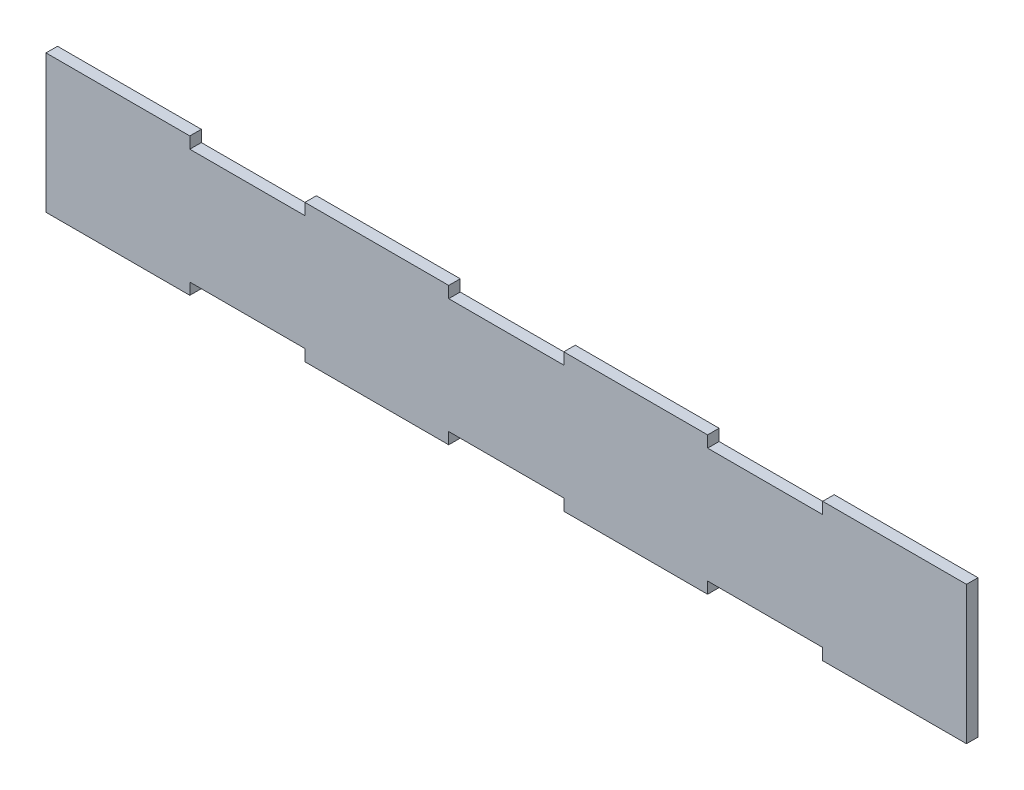
ISO-10303-21;
HEADER;
FILE_DESCRIPTION(('STEP AP214'),'2;1');
FILE_NAME('part.step','',(''),(''),'','','');
FILE_SCHEMA(('AUTOMOTIVE_DESIGN { 1 0 10303 214 1 1 1 1 }'));
ENDSEC;
DATA;
#1=APPLICATION_CONTEXT('core data for automotive mechanical design processes');
#2=APPLICATION_PROTOCOL_DEFINITION('international standard','automotive_design',2000,#1);
#3=PRODUCT_CONTEXT('',#1,'mechanical');
#4=PRODUCT('Part','Part','',(#3));
#5=PRODUCT_RELATED_PRODUCT_CATEGORY('part','',(#4));
#6=PRODUCT_DEFINITION_FORMATION('','',#4);
#7=PRODUCT_DEFINITION_CONTEXT('part definition',#1,'design');
#8=PRODUCT_DEFINITION('design','',#6,#7);
#9=PRODUCT_DEFINITION_SHAPE('','',#8);
#10=(LENGTH_UNIT() NAMED_UNIT(*) SI_UNIT(.MILLI.,.METRE.));
#11=(NAMED_UNIT(*) PLANE_ANGLE_UNIT() SI_UNIT($,.RADIAN.));
#12=(NAMED_UNIT(*) SI_UNIT($,.STERADIAN.) SOLID_ANGLE_UNIT());
#13=UNCERTAINTY_MEASURE_WITH_UNIT(LENGTH_MEASURE(1.E-05),#10,'distance_accuracy_value','');
#14=(GEOMETRIC_REPRESENTATION_CONTEXT(3) GLOBAL_UNCERTAINTY_ASSIGNED_CONTEXT((#13)) GLOBAL_UNIT_ASSIGNED_CONTEXT((#10,
#11,#12)) REPRESENTATION_CONTEXT('',''));
#15=CARTESIAN_POINT('',(0.,0.,0.));
#16=DIRECTION('',(0.,0.,1.));
#17=DIRECTION('',(1.,0.,0.));
#18=AXIS2_PLACEMENT_3D('',#15,#16,#17);
#19=CARTESIAN_POINT('',(135.,0.,2.));
#20=DIRECTION('',(-1.,0.,0.));
#21=DIRECTION('',(0.,0.,1.));
#22=AXIS2_PLACEMENT_3D('',#19,#20,#21);
#23=PLANE('',#22);
#24=DIRECTION('',(0.,1.,0.));
#25=VECTOR('',#24,1.);
#26=CARTESIAN_POINT('',(135.,0.,0.));
#27=LINE('',#26,#25);
#28=CARTESIAN_POINT('',(135.,0.,0.));
#29=VERTEX_POINT('',#28);
#30=CARTESIAN_POINT('',(135.,2.,0.));
#31=VERTEX_POINT('',#30);
#32=EDGE_CURVE('E250',#29,#31,#27,.T.);
#33=ORIENTED_EDGE('',*,*,#32,.F.);
#34=DIRECTION('',(0.,0.,-1.));
#35=VECTOR('',#34,1.);
#36=CARTESIAN_POINT('',(135.,0.,2.));
#37=LINE('',#36,#35);
#38=CARTESIAN_POINT('',(135.,0.,2.));
#39=VERTEX_POINT('',#38);
#40=EDGE_CURVE('E11',#39,#29,#37,.T.);
#41=ORIENTED_EDGE('',*,*,#40,.F.);
#42=DIRECTION('',(0.,1.,0.));
#43=VECTOR('',#42,1.);
#44=CARTESIAN_POINT('',(135.,0.,2.));
#45=LINE('',#44,#43);
#46=CARTESIAN_POINT('',(135.,2.,2.));
#47=VERTEX_POINT('',#46);
#48=EDGE_CURVE('E315',#39,#47,#45,.T.);
#49=ORIENTED_EDGE('',*,*,#48,.T.);
#50=DIRECTION('',(0.,0.,-1.));
#51=VECTOR('',#50,1.);
#52=CARTESIAN_POINT('',(135.,2.,2.));
#53=LINE('',#52,#51);
#54=EDGE_CURVE('E146',#47,#31,#53,.T.);
#55=ORIENTED_EDGE('',*,*,#54,.T.);
#56=EDGE_LOOP('',(#33,#41,#49,#55));
#57=FACE_BOUND('',#56,.T.);
#58=ADVANCED_FACE('F35',(#57),#23,.T.);
#59=CARTESIAN_POINT('',(0.,0.,2.));
#60=DIRECTION('',(0.,1.,0.));
#61=DIRECTION('',(0.,0.,1.));
#62=AXIS2_PLACEMENT_3D('',#59,#60,#61);
#63=PLANE('',#62);
#64=DIRECTION('',(1.,0.,0.));
#65=VECTOR('',#64,1.);
#66=CARTESIAN_POINT('',(0.,0.,0.));
#67=LINE('',#66,#65);
#68=CARTESIAN_POINT('',(160.,0.,0.));
#69=VERTEX_POINT('',#68);
#70=EDGE_CURVE('E253',#29,#69,#67,.T.);
#71=ORIENTED_EDGE('',*,*,#70,.T.);
#72=DIRECTION('',(0.,0.,-1.));
#73=VECTOR('',#72,1.);
#74=CARTESIAN_POINT('',(160.,0.,2.));
#75=LINE('',#74,#73);
#76=CARTESIAN_POINT('',(160.,0.,2.));
#77=VERTEX_POINT('',#76);
#78=EDGE_CURVE('E43',#77,#69,#75,.T.);
#79=ORIENTED_EDGE('',*,*,#78,.F.);
#80=DIRECTION('',(1.,0.,0.));
#81=VECTOR('',#80,1.);
#82=CARTESIAN_POINT('',(0.,0.,2.));
#83=LINE('',#82,#81);
#84=EDGE_CURVE('E236',#39,#77,#83,.T.);
#85=ORIENTED_EDGE('',*,*,#84,.F.);
#86=ORIENTED_EDGE('',*,*,#40,.T.);
#87=EDGE_LOOP('',(#71,#79,#85,#86));
#88=FACE_BOUND('',#87,.T.);
#89=ADVANCED_FACE('F488',(#88),#63,.F.);
#90=CARTESIAN_POINT('',(160.,0.,2.));
#91=DIRECTION('',(-1.,0.,0.));
#92=DIRECTION('',(0.,0.,1.));
#93=AXIS2_PLACEMENT_3D('',#90,#91,#92);
#94=PLANE('',#93);
#95=DIRECTION('',(0.,1.,0.));
#96=VECTOR('',#95,1.);
#97=CARTESIAN_POINT('',(160.,0.,0.));
#98=LINE('',#97,#96);
#99=CARTESIAN_POINT('',(160.,24.,0.));
#100=VERTEX_POINT('',#99);
#101=EDGE_CURVE('E255',#69,#100,#98,.T.);
#102=ORIENTED_EDGE('',*,*,#101,.T.);
#103=DIRECTION('',(0.,0.,-1.));
#104=VECTOR('',#103,1.);
#105=CARTESIAN_POINT('',(160.,24.,2.));
#106=LINE('',#105,#104);
#107=CARTESIAN_POINT('',(160.,24.,2.));
#108=VERTEX_POINT('',#107);
#109=EDGE_CURVE('E365',#108,#100,#106,.T.);
#110=ORIENTED_EDGE('',*,*,#109,.F.);
#111=DIRECTION('',(0.,1.,0.));
#112=VECTOR('',#111,1.);
#113=CARTESIAN_POINT('',(160.,0.,2.));
#114=LINE('',#113,#112);
#115=EDGE_CURVE('E373',#77,#108,#114,.T.);
#116=ORIENTED_EDGE('',*,*,#115,.F.);
#117=ORIENTED_EDGE('',*,*,#78,.T.);
#118=EDGE_LOOP('',(#102,#110,#116,#117));
#119=FACE_BOUND('',#118,.T.);
#120=ADVANCED_FACE('F371',(#119),#94,.F.);
#121=CARTESIAN_POINT('',(0.,24.,2.));
#122=DIRECTION('',(0.,1.,0.));
#123=DIRECTION('',(0.,0.,1.));
#124=AXIS2_PLACEMENT_3D('',#121,#122,#123);
#125=PLANE('',#124);
#126=DIRECTION('',(1.,0.,0.));
#127=VECTOR('',#126,1.);
#128=CARTESIAN_POINT('',(0.,24.,0.));
#129=LINE('',#128,#127);
#130=CARTESIAN_POINT('',(135.,24.,0.));
#131=VERTEX_POINT('',#130);
#132=EDGE_CURVE('E259',#131,#100,#129,.T.);
#133=ORIENTED_EDGE('',*,*,#132,.F.);
#134=DIRECTION('',(0.,0.,-1.));
#135=VECTOR('',#134,1.);
#136=CARTESIAN_POINT('',(135.,24.,2.));
#137=LINE('',#136,#135);
#138=CARTESIAN_POINT('',(135.,24.,2.));
#139=VERTEX_POINT('',#138);
#140=EDGE_CURVE('E363',#139,#131,#137,.T.);
#141=ORIENTED_EDGE('',*,*,#140,.F.);
#142=DIRECTION('',(1.,0.,0.));
#143=VECTOR('',#142,1.);
#144=CARTESIAN_POINT('',(0.,24.,2.));
#145=LINE('',#144,#143);
#146=EDGE_CURVE('E385',#139,#108,#145,.T.);
#147=ORIENTED_EDGE('',*,*,#146,.T.);
#148=ORIENTED_EDGE('',*,*,#109,.T.);
#149=EDGE_LOOP('',(#133,#141,#147,#148));
#150=FACE_BOUND('',#149,.T.);
#151=ADVANCED_FACE('F381',(#150),#125,.T.);
#152=CARTESIAN_POINT('',(135.,0.,2.));
#153=DIRECTION('',(1.,0.,0.));
#154=DIRECTION('',(0.,0.,-1.));
#155=AXIS2_PLACEMENT_3D('',#152,#153,#154);
#156=PLANE('',#155);
#157=DIRECTION('',(0.,-1.,0.));
#158=VECTOR('',#157,1.);
#159=CARTESIAN_POINT('',(135.,0.,0.));
#160=LINE('',#159,#158);
#161=CARTESIAN_POINT('',(135.,22.,0.));
#162=VERTEX_POINT('',#161);
#163=EDGE_CURVE('E262',#131,#162,#160,.T.);
#164=ORIENTED_EDGE('',*,*,#163,.T.);
#165=DIRECTION('',(0.,0.,-1.));
#166=VECTOR('',#165,1.);
#167=CARTESIAN_POINT('',(135.,22.,2.));
#168=LINE('',#167,#166);
#169=CARTESIAN_POINT('',(135.,22.,2.));
#170=VERTEX_POINT('',#169);
#171=EDGE_CURVE('E361',#170,#162,#168,.T.);
#172=ORIENTED_EDGE('',*,*,#171,.F.);
#173=DIRECTION('',(0.,-1.,0.));
#174=VECTOR('',#173,1.);
#175=CARTESIAN_POINT('',(135.,0.,2.));
#176=LINE('',#175,#174);
#177=EDGE_CURVE('E386',#139,#170,#176,.T.);
#178=ORIENTED_EDGE('',*,*,#177,.F.);
#179=ORIENTED_EDGE('',*,*,#140,.T.);
#180=EDGE_LOOP('',(#164,#172,#178,#179));
#181=FACE_BOUND('',#180,.T.);
#182=ADVANCED_FACE('F685',(#181),#156,.F.);
#183=CARTESIAN_POINT('',(0.,22.,2.));
#184=DIRECTION('',(0.,1.,0.));
#185=DIRECTION('',(0.,0.,1.));
#186=AXIS2_PLACEMENT_3D('',#183,#184,#185);
#187=PLANE('',#186);
#188=DIRECTION('',(1.,0.,0.));
#189=VECTOR('',#188,1.);
#190=CARTESIAN_POINT('',(0.,22.,0.));
#191=LINE('',#190,#189);
#192=CARTESIAN_POINT('',(115.,22.,0.));
#193=VERTEX_POINT('',#192);
#194=EDGE_CURVE('E267',#193,#162,#191,.T.);
#195=ORIENTED_EDGE('',*,*,#194,.F.);
#196=DIRECTION('',(0.,0.,-1.));
#197=VECTOR('',#196,1.);
#198=CARTESIAN_POINT('',(115.,22.,2.));
#199=LINE('',#198,#197);
#200=CARTESIAN_POINT('',(115.,22.,2.));
#201=VERTEX_POINT('',#200);
#202=EDGE_CURVE('E359',#201,#193,#199,.T.);
#203=ORIENTED_EDGE('',*,*,#202,.F.);
#204=DIRECTION('',(1.,0.,0.));
#205=VECTOR('',#204,1.);
#206=CARTESIAN_POINT('',(0.,22.,2.));
#207=LINE('',#206,#205);
#208=EDGE_CURVE('E390',#201,#170,#207,.T.);
#209=ORIENTED_EDGE('',*,*,#208,.T.);
#210=ORIENTED_EDGE('',*,*,#171,.T.);
#211=EDGE_LOOP('',(#195,#203,#209,#210));
#212=FACE_BOUND('',#211,.T.);
#213=ADVANCED_FACE('F676',(#212),#187,.T.);
#214=CARTESIAN_POINT('',(115.,0.,2.));
#215=DIRECTION('',(1.,0.,0.));
#216=DIRECTION('',(0.,0.,-1.));
#217=AXIS2_PLACEMENT_3D('',#214,#215,#216);
#218=PLANE('',#217);
#219=DIRECTION('',(0.,-1.,0.));
#220=VECTOR('',#219,1.);
#221=CARTESIAN_POINT('',(115.,0.,0.));
#222=LINE('',#221,#220);
#223=CARTESIAN_POINT('',(115.,24.,0.));
#224=VERTEX_POINT('',#223);
#225=EDGE_CURVE('E270',#224,#193,#222,.T.);
#226=ORIENTED_EDGE('',*,*,#225,.F.);
#227=DIRECTION('',(0.,0.,-1.));
#228=VECTOR('',#227,1.);
#229=CARTESIAN_POINT('',(115.,24.,2.));
#230=LINE('',#229,#228);
#231=CARTESIAN_POINT('',(115.,24.,2.));
#232=VERTEX_POINT('',#231);
#233=EDGE_CURVE('E357',#232,#224,#230,.T.);
#234=ORIENTED_EDGE('',*,*,#233,.F.);
#235=DIRECTION('',(0.,-1.,0.));
#236=VECTOR('',#235,1.);
#237=CARTESIAN_POINT('',(115.,0.,2.));
#238=LINE('',#237,#236);
#239=EDGE_CURVE('E399',#232,#201,#238,.T.);
#240=ORIENTED_EDGE('',*,*,#239,.T.);
#241=ORIENTED_EDGE('',*,*,#202,.T.);
#242=EDGE_LOOP('',(#226,#234,#240,#241));
#243=FACE_BOUND('',#242,.T.);
#244=ADVANCED_FACE('F669',(#243),#218,.T.);
#245=CARTESIAN_POINT('',(90.,24.,0.));
#246=VERTEX_POINT('',#245);
#247=EDGE_CURVE('E264',#246,#224,#129,.T.);
#248=ORIENTED_EDGE('',*,*,#247,.F.);
#249=DIRECTION('',(0.,0.,-1.));
#250=VECTOR('',#249,1.);
#251=CARTESIAN_POINT('',(90.,24.,2.));
#252=LINE('',#251,#250);
#253=CARTESIAN_POINT('',(90.,24.,2.));
#254=VERTEX_POINT('',#253);
#255=EDGE_CURVE('E355',#254,#246,#252,.T.);
#256=ORIENTED_EDGE('',*,*,#255,.F.);
#257=EDGE_CURVE('E389',#254,#232,#145,.T.);
#258=ORIENTED_EDGE('',*,*,#257,.T.);
#259=ORIENTED_EDGE('',*,*,#233,.T.);
#260=EDGE_LOOP('',(#248,#256,#258,#259));
#261=FACE_BOUND('',#260,.T.);
#262=ADVANCED_FACE('F637',(#261),#125,.T.);
#263=CARTESIAN_POINT('',(90.,0.,2.));
#264=DIRECTION('',(1.,0.,0.));
#265=DIRECTION('',(0.,0.,-1.));
#266=AXIS2_PLACEMENT_3D('',#263,#264,#265);
#267=PLANE('',#266);
#268=DIRECTION('',(0.,-1.,0.));
#269=VECTOR('',#268,1.);
#270=CARTESIAN_POINT('',(90.,0.,0.));
#271=LINE('',#270,#269);
#272=CARTESIAN_POINT('',(90.,22.,0.));
#273=VERTEX_POINT('',#272);
#274=EDGE_CURVE('E273',#246,#273,#271,.T.);
#275=ORIENTED_EDGE('',*,*,#274,.T.);
#276=DIRECTION('',(0.,0.,-1.));
#277=VECTOR('',#276,1.);
#278=CARTESIAN_POINT('',(90.,22.,2.));
#279=LINE('',#278,#277);
#280=CARTESIAN_POINT('',(90.,22.,2.));
#281=VERTEX_POINT('',#280);
#282=EDGE_CURVE('E353',#281,#273,#279,.T.);
#283=ORIENTED_EDGE('',*,*,#282,.F.);
#284=DIRECTION('',(0.,-1.,0.));
#285=VECTOR('',#284,1.);
#286=CARTESIAN_POINT('',(90.,0.,2.));
#287=LINE('',#286,#285);
#288=EDGE_CURVE('E398',#254,#281,#287,.T.);
#289=ORIENTED_EDGE('',*,*,#288,.F.);
#290=ORIENTED_EDGE('',*,*,#255,.T.);
#291=EDGE_LOOP('',(#275,#283,#289,#290));
#292=FACE_BOUND('',#291,.T.);
#293=ADVANCED_FACE('F652',(#292),#267,.F.);
#294=CARTESIAN_POINT('',(0.,22.,2.));
#295=DIRECTION('',(0.,1.,0.));
#296=DIRECTION('',(-1.,0.,0.));
#297=AXIS2_PLACEMENT_3D('',#294,#295,#296);
#298=PLANE('',#297);
#299=DIRECTION('',(1.,0.,0.));
#300=VECTOR('',#299,1.);
#301=CARTESIAN_POINT('',(0.,22.,0.));
#302=LINE('',#301,#300);
#303=CARTESIAN_POINT('',(70.,22.,0.));
#304=VERTEX_POINT('',#303);
#305=EDGE_CURVE('E276',#304,#273,#302,.T.);
#306=ORIENTED_EDGE('',*,*,#305,.F.);
#307=DIRECTION('',(0.,0.,-1.));
#308=VECTOR('',#307,1.);
#309=CARTESIAN_POINT('',(70.,22.,2.));
#310=LINE('',#309,#308);
#311=CARTESIAN_POINT('',(70.,22.,2.));
#312=VERTEX_POINT('',#311);
#313=EDGE_CURVE('E351',#312,#304,#310,.T.);
#314=ORIENTED_EDGE('',*,*,#313,.F.);
#315=DIRECTION('',(1.,0.,0.));
#316=VECTOR('',#315,1.);
#317=CARTESIAN_POINT('',(0.,22.,2.));
#318=LINE('',#317,#316);
#319=EDGE_CURVE('E402',#312,#281,#318,.T.);
#320=ORIENTED_EDGE('',*,*,#319,.T.);
#321=ORIENTED_EDGE('',*,*,#282,.T.);
#322=EDGE_LOOP('',(#306,#314,#320,#321));
#323=FACE_BOUND('',#322,.T.);
#324=ADVANCED_FACE('F644',(#323),#298,.T.);
#325=CARTESIAN_POINT('',(70.,0.,2.));
#326=DIRECTION('',(1.,0.,0.));
#327=DIRECTION('',(0.,0.,-1.));
#328=AXIS2_PLACEMENT_3D('',#325,#326,#327);
#329=PLANE('',#328);
#330=DIRECTION('',(0.,-1.,0.));
#331=VECTOR('',#330,1.);
#332=CARTESIAN_POINT('',(70.,0.,0.));
#333=LINE('',#332,#331);
#334=CARTESIAN_POINT('',(70.,24.,0.));
#335=VERTEX_POINT('',#334);
#336=EDGE_CURVE('E279',#335,#304,#333,.T.);
#337=ORIENTED_EDGE('',*,*,#336,.F.);
#338=DIRECTION('',(0.,0.,-1.));
#339=VECTOR('',#338,1.);
#340=CARTESIAN_POINT('',(70.,24.,2.));
#341=LINE('',#340,#339);
#342=CARTESIAN_POINT('',(70.,24.,2.));
#343=VERTEX_POINT('',#342);
#344=EDGE_CURVE('E349',#343,#335,#341,.T.);
#345=ORIENTED_EDGE('',*,*,#344,.F.);
#346=DIRECTION('',(0.,-1.,0.));
#347=VECTOR('',#346,1.);
#348=CARTESIAN_POINT('',(70.,0.,2.));
#349=LINE('',#348,#347);
#350=EDGE_CURVE('E408',#343,#312,#349,.T.);
#351=ORIENTED_EDGE('',*,*,#350,.T.);
#352=ORIENTED_EDGE('',*,*,#313,.T.);
#353=EDGE_LOOP('',(#337,#345,#351,#352));
#354=FACE_BOUND('',#353,.T.);
#355=ADVANCED_FACE('F636',(#354),#329,.T.);
#356=CARTESIAN_POINT('',(45.,24.,0.));
#357=VERTEX_POINT('',#356);
#358=EDGE_CURVE('E282',#357,#335,#129,.T.);
#359=ORIENTED_EDGE('',*,*,#358,.F.);
#360=DIRECTION('',(0.,0.,-1.));
#361=VECTOR('',#360,1.);
#362=CARTESIAN_POINT('',(45.,24.,2.));
#363=LINE('',#362,#361);
#364=CARTESIAN_POINT('',(45.,24.,2.));
#365=VERTEX_POINT('',#364);
#366=EDGE_CURVE('E347',#365,#357,#363,.T.);
#367=ORIENTED_EDGE('',*,*,#366,.F.);
#368=EDGE_CURVE('E396',#365,#343,#145,.T.);
#369=ORIENTED_EDGE('',*,*,#368,.T.);
#370=ORIENTED_EDGE('',*,*,#344,.T.);
#371=EDGE_LOOP('',(#359,#367,#369,#370));
#372=FACE_BOUND('',#371,.T.);
#373=ADVANCED_FACE('F603',(#372),#125,.T.);
#374=CARTESIAN_POINT('',(45.,0.,2.));
#375=DIRECTION('',(1.,0.,0.));
#376=DIRECTION('',(0.,0.,-1.));
#377=AXIS2_PLACEMENT_3D('',#374,#375,#376);
#378=PLANE('',#377);
#379=DIRECTION('',(0.,-1.,0.));
#380=VECTOR('',#379,1.);
#381=CARTESIAN_POINT('',(45.,0.,0.));
#382=LINE('',#381,#380);
#383=CARTESIAN_POINT('',(45.,22.,0.));
#384=VERTEX_POINT('',#383);
#385=EDGE_CURVE('E283',#357,#384,#382,.T.);
#386=ORIENTED_EDGE('',*,*,#385,.T.);
#387=DIRECTION('',(0.,0.,-1.));
#388=VECTOR('',#387,1.);
#389=CARTESIAN_POINT('',(45.,22.,2.));
#390=LINE('',#389,#388);
#391=CARTESIAN_POINT('',(45.,22.,2.));
#392=VERTEX_POINT('',#391);
#393=EDGE_CURVE('E345',#392,#384,#390,.T.);
#394=ORIENTED_EDGE('',*,*,#393,.F.);
#395=DIRECTION('',(0.,-1.,0.));
#396=VECTOR('',#395,1.);
#397=CARTESIAN_POINT('',(45.,0.,2.));
#398=LINE('',#397,#396);
#399=EDGE_CURVE('E407',#365,#392,#398,.T.);
#400=ORIENTED_EDGE('',*,*,#399,.F.);
#401=ORIENTED_EDGE('',*,*,#366,.T.);
#402=EDGE_LOOP('',(#386,#394,#400,#401));
#403=FACE_BOUND('',#402,.T.);
#404=ADVANCED_FACE('F619',(#403),#378,.F.);
#405=CARTESIAN_POINT('',(0.,22.,2.));
#406=DIRECTION('',(0.,1.,0.));
#407=DIRECTION('',(0.,0.,1.));
#408=AXIS2_PLACEMENT_3D('',#405,#406,#407);
#409=PLANE('',#408);
#410=DIRECTION('',(1.,0.,0.));
#411=VECTOR('',#410,1.);
#412=CARTESIAN_POINT('',(0.,22.,0.));
#413=LINE('',#412,#411);
#414=CARTESIAN_POINT('',(25.,22.,0.));
#415=VERTEX_POINT('',#414);
#416=EDGE_CURVE('E286',#415,#384,#413,.T.);
#417=ORIENTED_EDGE('',*,*,#416,.F.);
#418=DIRECTION('',(0.,0.,-1.));
#419=VECTOR('',#418,1.);
#420=CARTESIAN_POINT('',(25.,22.,2.));
#421=LINE('',#420,#419);
#422=CARTESIAN_POINT('',(25.,22.,2.));
#423=VERTEX_POINT('',#422);
#424=EDGE_CURVE('E343',#423,#415,#421,.T.);
#425=ORIENTED_EDGE('',*,*,#424,.F.);
#426=DIRECTION('',(1.,0.,0.));
#427=VECTOR('',#426,1.);
#428=CARTESIAN_POINT('',(0.,22.,2.));
#429=LINE('',#428,#427);
#430=EDGE_CURVE('E411',#423,#392,#429,.T.);
#431=ORIENTED_EDGE('',*,*,#430,.T.);
#432=ORIENTED_EDGE('',*,*,#393,.T.);
#433=EDGE_LOOP('',(#417,#425,#431,#432));
#434=FACE_BOUND('',#433,.T.);
#435=ADVANCED_FACE('F610',(#434),#409,.T.);
#436=CARTESIAN_POINT('',(25.,0.,2.));
#437=DIRECTION('',(1.,0.,0.));
#438=DIRECTION('',(0.,0.,-1.));
#439=AXIS2_PLACEMENT_3D('',#436,#437,#438);
#440=PLANE('',#439);
#441=DIRECTION('',(0.,-1.,0.));
#442=VECTOR('',#441,1.);
#443=CARTESIAN_POINT('',(25.,0.,0.));
#444=LINE('',#443,#442);
#445=CARTESIAN_POINT('',(25.,24.,0.));
#446=VERTEX_POINT('',#445);
#447=EDGE_CURVE('E289',#446,#415,#444,.T.);
#448=ORIENTED_EDGE('',*,*,#447,.F.);
#449=DIRECTION('',(0.,0.,-1.));
#450=VECTOR('',#449,1.);
#451=CARTESIAN_POINT('',(25.,24.,2.));
#452=LINE('',#451,#450);
#453=CARTESIAN_POINT('',(25.,24.,2.));
#454=VERTEX_POINT('',#453);
#455=EDGE_CURVE('E341',#454,#446,#452,.T.);
#456=ORIENTED_EDGE('',*,*,#455,.F.);
#457=DIRECTION('',(0.,-1.,0.));
#458=VECTOR('',#457,1.);
#459=CARTESIAN_POINT('',(25.,0.,2.));
#460=LINE('',#459,#458);
#461=EDGE_CURVE('E395',#454,#423,#460,.T.);
#462=ORIENTED_EDGE('',*,*,#461,.T.);
#463=ORIENTED_EDGE('',*,*,#424,.T.);
#464=EDGE_LOOP('',(#448,#456,#462,#463));
#465=FACE_BOUND('',#464,.T.);
#466=ADVANCED_FACE('F600',(#465),#440,.T.);
#467=CARTESIAN_POINT('',(0.,24.,0.));
#468=VERTEX_POINT('',#467);
#469=EDGE_CURVE('E263',#468,#446,#129,.T.);
#470=ORIENTED_EDGE('',*,*,#469,.F.);
#471=DIRECTION('',(0.,0.,-1.));
#472=VECTOR('',#471,1.);
#473=CARTESIAN_POINT('',(0.,24.,2.));
#474=LINE('',#473,#472);
#475=CARTESIAN_POINT('',(0.,24.,2.));
#476=VERTEX_POINT('',#475);
#477=EDGE_CURVE('E339',#476,#468,#474,.T.);
#478=ORIENTED_EDGE('',*,*,#477,.F.);
#479=EDGE_CURVE('E388',#476,#454,#145,.T.);
#480=ORIENTED_EDGE('',*,*,#479,.T.);
#481=ORIENTED_EDGE('',*,*,#455,.T.);
#482=EDGE_LOOP('',(#470,#478,#480,#481));
#483=FACE_BOUND('',#482,.T.);
#484=ADVANCED_FACE('F591',(#483),#125,.T.);
#485=CARTESIAN_POINT('',(0.,0.,2.));
#486=DIRECTION('',(-1.,0.,0.));
#487=DIRECTION('',(0.,0.,1.));
#488=AXIS2_PLACEMENT_3D('',#485,#486,#487);
#489=PLANE('',#488);
#490=DIRECTION('',(0.,1.,0.));
#491=VECTOR('',#490,1.);
#492=CARTESIAN_POINT('',(0.,0.,0.));
#493=LINE('',#492,#491);
#494=CARTESIAN_POINT('',(0.,0.,0.));
#495=VERTEX_POINT('',#494);
#496=EDGE_CURVE('E292',#495,#468,#493,.T.);
#497=ORIENTED_EDGE('',*,*,#496,.F.);
#498=DIRECTION('',(0.,0.,-1.));
#499=VECTOR('',#498,1.);
#500=CARTESIAN_POINT('',(0.,0.,2.));
#501=LINE('',#500,#499);
#502=CARTESIAN_POINT('',(0.,0.,2.));
#503=VERTEX_POINT('',#502);
#504=EDGE_CURVE('E337',#503,#495,#501,.T.);
#505=ORIENTED_EDGE('',*,*,#504,.F.);
#506=DIRECTION('',(0.,1.,0.));
#507=VECTOR('',#506,1.);
#508=CARTESIAN_POINT('',(0.,0.,2.));
#509=LINE('',#508,#507);
#510=EDGE_CURVE('E394',#503,#476,#509,.T.);
#511=ORIENTED_EDGE('',*,*,#510,.T.);
#512=ORIENTED_EDGE('',*,*,#477,.T.);
#513=EDGE_LOOP('',(#497,#505,#511,#512));
#514=FACE_BOUND('',#513,.T.);
#515=ADVANCED_FACE('F584',(#514),#489,.T.);
#516=CARTESIAN_POINT('',(25.,0.,0.));
#517=VERTEX_POINT('',#516);
#518=EDGE_CURVE('E256',#495,#517,#67,.T.);
#519=ORIENTED_EDGE('',*,*,#518,.T.);
#520=DIRECTION('',(0.,0.,-1.));
#521=VECTOR('',#520,1.);
#522=CARTESIAN_POINT('',(25.,0.,2.));
#523=LINE('',#522,#521);
#524=CARTESIAN_POINT('',(25.,0.,2.));
#525=VERTEX_POINT('',#524);
#526=EDGE_CURVE('E334',#525,#517,#523,.T.);
#527=ORIENTED_EDGE('',*,*,#526,.F.);
#528=EDGE_CURVE('E426',#503,#525,#83,.T.);
#529=ORIENTED_EDGE('',*,*,#528,.F.);
#530=ORIENTED_EDGE('',*,*,#504,.T.);
#531=EDGE_LOOP('',(#519,#527,#529,#530));
#532=FACE_BOUND('',#531,.T.);
#533=ADVANCED_FACE('F449',(#532),#63,.F.);
#534=CARTESIAN_POINT('',(25.,0.,2.));
#535=DIRECTION('',(-1.,0.,0.));
#536=DIRECTION('',(0.,0.,1.));
#537=AXIS2_PLACEMENT_3D('',#534,#535,#536);
#538=PLANE('',#537);
#539=DIRECTION('',(0.,1.,0.));
#540=VECTOR('',#539,1.);
#541=CARTESIAN_POINT('',(25.,0.,0.));
#542=LINE('',#541,#540);
#543=CARTESIAN_POINT('',(25.,2.,0.));
#544=VERTEX_POINT('',#543);
#545=EDGE_CURVE('E295',#517,#544,#542,.T.);
#546=ORIENTED_EDGE('',*,*,#545,.T.);
#547=DIRECTION('',(0.,0.,-1.));
#548=VECTOR('',#547,1.);
#549=CARTESIAN_POINT('',(25.,2.,2.));
#550=LINE('',#549,#548);
#551=CARTESIAN_POINT('',(25.,2.,2.));
#552=VERTEX_POINT('',#551);
#553=EDGE_CURVE('E331',#552,#544,#550,.T.);
#554=ORIENTED_EDGE('',*,*,#553,.F.);
#555=DIRECTION('',(0.,1.,0.));
#556=VECTOR('',#555,1.);
#557=CARTESIAN_POINT('',(25.,0.,2.));
#558=LINE('',#557,#556);
#559=EDGE_CURVE('E427',#525,#552,#558,.T.);
#560=ORIENTED_EDGE('',*,*,#559,.F.);
#561=ORIENTED_EDGE('',*,*,#526,.T.);
#562=EDGE_LOOP('',(#546,#554,#560,#561));
#563=FACE_BOUND('',#562,.T.);
#564=ADVANCED_FACE('F455',(#563),#538,.F.);
#565=CARTESIAN_POINT('',(0.,2.,2.));
#566=DIRECTION('',(0.,1.,0.));
#567=DIRECTION('',(0.,0.,1.));
#568=AXIS2_PLACEMENT_3D('',#565,#566,#567);
#569=PLANE('',#568);
#570=DIRECTION('',(1.,0.,0.));
#571=VECTOR('',#570,1.);
#572=CARTESIAN_POINT('',(0.,2.,0.));
#573=LINE('',#572,#571);
#574=CARTESIAN_POINT('',(45.,2.,0.));
#575=VERTEX_POINT('',#574);
#576=EDGE_CURVE('E297',#544,#575,#573,.T.);
#577=ORIENTED_EDGE('',*,*,#576,.T.);
#578=DIRECTION('',(0.,0.,-1.));
#579=VECTOR('',#578,1.);
#580=CARTESIAN_POINT('',(45.,2.,2.));
#581=LINE('',#580,#579);
#582=CARTESIAN_POINT('',(45.,2.,2.));
#583=VERTEX_POINT('',#582);
#584=EDGE_CURVE('E329',#583,#575,#581,.T.);
#585=ORIENTED_EDGE('',*,*,#584,.F.);
#586=DIRECTION('',(1.,0.,0.));
#587=VECTOR('',#586,1.);
#588=CARTESIAN_POINT('',(0.,2.,2.));
#589=LINE('',#588,#587);
#590=EDGE_CURVE('E429',#552,#583,#589,.T.);
#591=ORIENTED_EDGE('',*,*,#590,.F.);
#592=ORIENTED_EDGE('',*,*,#553,.T.);
#593=EDGE_LOOP('',(#577,#585,#591,#592));
#594=FACE_BOUND('',#593,.T.);
#595=ADVANCED_FACE('F461',(#594),#569,.F.);
#596=CARTESIAN_POINT('',(45.,0.,2.));
#597=DIRECTION('',(-1.,0.,0.));
#598=DIRECTION('',(0.,0.,1.));
#599=AXIS2_PLACEMENT_3D('',#596,#597,#598);
#600=PLANE('',#599);
#601=DIRECTION('',(0.,1.,0.));
#602=VECTOR('',#601,1.);
#603=CARTESIAN_POINT('',(45.,0.,0.));
#604=LINE('',#603,#602);
#605=CARTESIAN_POINT('',(45.,0.,0.));
#606=VERTEX_POINT('',#605);
#607=EDGE_CURVE('E300',#606,#575,#604,.T.);
#608=ORIENTED_EDGE('',*,*,#607,.F.);
#609=DIRECTION('',(0.,0.,-1.));
#610=VECTOR('',#609,1.);
#611=CARTESIAN_POINT('',(45.,0.,2.));
#612=LINE('',#611,#610);
#613=CARTESIAN_POINT('',(45.,0.,2.));
#614=VERTEX_POINT('',#613);
#615=EDGE_CURVE('E327',#614,#606,#612,.T.);
#616=ORIENTED_EDGE('',*,*,#615,.F.);
#617=DIRECTION('',(0.,1.,0.));
#618=VECTOR('',#617,1.);
#619=CARTESIAN_POINT('',(45.,0.,2.));
#620=LINE('',#619,#618);
#621=EDGE_CURVE('E431',#614,#583,#620,.T.);
#622=ORIENTED_EDGE('',*,*,#621,.T.);
#623=ORIENTED_EDGE('',*,*,#584,.T.);
#624=EDGE_LOOP('',(#608,#616,#622,#623));
#625=FACE_BOUND('',#624,.T.);
#626=ADVANCED_FACE('F477',(#625),#600,.T.);
#627=CARTESIAN_POINT('',(70.,0.,0.));
#628=VERTEX_POINT('',#627);
#629=EDGE_CURVE('E303',#606,#628,#67,.T.);
#630=ORIENTED_EDGE('',*,*,#629,.T.);
#631=DIRECTION('',(0.,0.,-1.));
#632=VECTOR('',#631,1.);
#633=CARTESIAN_POINT('',(70.,0.,2.));
#634=LINE('',#633,#632);
#635=CARTESIAN_POINT('',(70.,0.,2.));
#636=VERTEX_POINT('',#635);
#637=EDGE_CURVE('E324',#636,#628,#634,.T.);
#638=ORIENTED_EDGE('',*,*,#637,.F.);
#639=EDGE_CURVE('E235',#614,#636,#83,.T.);
#640=ORIENTED_EDGE('',*,*,#639,.F.);
#641=ORIENTED_EDGE('',*,*,#615,.T.);
#642=EDGE_LOOP('',(#630,#638,#640,#641));
#643=FACE_BOUND('',#642,.T.);
#644=ADVANCED_FACE('F470',(#643),#63,.F.);
#645=CARTESIAN_POINT('',(70.,0.,2.));
#646=DIRECTION('',(-1.,0.,0.));
#647=DIRECTION('',(0.,0.,1.));
#648=AXIS2_PLACEMENT_3D('',#645,#646,#647);
#649=PLANE('',#648);
#650=DIRECTION('',(0.,1.,0.));
#651=VECTOR('',#650,1.);
#652=CARTESIAN_POINT('',(70.,0.,0.));
#653=LINE('',#652,#651);
#654=CARTESIAN_POINT('',(70.,2.,0.));
#655=VERTEX_POINT('',#654);
#656=EDGE_CURVE('E304',#628,#655,#653,.T.);
#657=ORIENTED_EDGE('',*,*,#656,.T.);
#658=DIRECTION('',(0.,0.,-1.));
#659=VECTOR('',#658,1.);
#660=CARTESIAN_POINT('',(70.,2.,2.));
#661=LINE('',#660,#659);
#662=CARTESIAN_POINT('',(70.,2.,2.));
#663=VERTEX_POINT('',#662);
#664=EDGE_CURVE('E321',#663,#655,#661,.T.);
#665=ORIENTED_EDGE('',*,*,#664,.F.);
#666=DIRECTION('',(0.,1.,0.));
#667=VECTOR('',#666,1.);
#668=CARTESIAN_POINT('',(70.,0.,2.));
#669=LINE('',#668,#667);
#670=EDGE_CURVE('E434',#636,#663,#669,.T.);
#671=ORIENTED_EDGE('',*,*,#670,.F.);
#672=ORIENTED_EDGE('',*,*,#637,.T.);
#673=EDGE_LOOP('',(#657,#665,#671,#672));
#674=FACE_BOUND('',#673,.T.);
#675=ADVANCED_FACE('F473',(#674),#649,.F.);
#676=CARTESIAN_POINT('',(0.,2.,2.));
#677=DIRECTION('',(0.,1.,0.));
#678=DIRECTION('',(0.,0.,1.));
#679=AXIS2_PLACEMENT_3D('',#676,#677,#678);
#680=PLANE('',#679);
#681=DIRECTION('',(1.,0.,0.));
#682=VECTOR('',#681,1.);
#683=CARTESIAN_POINT('',(0.,2.,0.));
#684=LINE('',#683,#682);
#685=CARTESIAN_POINT('',(90.,2.,0.));
#686=VERTEX_POINT('',#685);
#687=EDGE_CURVE('E306',#655,#686,#684,.T.);
#688=ORIENTED_EDGE('',*,*,#687,.T.);
#689=DIRECTION('',(0.,0.,-1.));
#690=VECTOR('',#689,1.);
#691=CARTESIAN_POINT('',(90.,2.,2.));
#692=LINE('',#691,#690);
#693=CARTESIAN_POINT('',(90.,2.,2.));
#694=VERTEX_POINT('',#693);
#695=EDGE_CURVE('E319',#694,#686,#692,.T.);
#696=ORIENTED_EDGE('',*,*,#695,.F.);
#697=DIRECTION('',(1.,0.,0.));
#698=VECTOR('',#697,1.);
#699=CARTESIAN_POINT('',(0.,2.,2.));
#700=LINE('',#699,#698);
#701=EDGE_CURVE('E435',#663,#694,#700,.T.);
#702=ORIENTED_EDGE('',*,*,#701,.F.);
#703=ORIENTED_EDGE('',*,*,#664,.T.);
#704=EDGE_LOOP('',(#688,#696,#702,#703));
#705=FACE_BOUND('',#704,.T.);
#706=ADVANCED_FACE('F475',(#705),#680,.F.);
#707=CARTESIAN_POINT('',(90.,0.,2.));
#708=DIRECTION('',(-1.,0.,0.));
#709=DIRECTION('',(0.,0.,1.));
#710=AXIS2_PLACEMENT_3D('',#707,#708,#709);
#711=PLANE('',#710);
#712=DIRECTION('',(0.,1.,0.));
#713=VECTOR('',#712,1.);
#714=CARTESIAN_POINT('',(90.,0.,0.));
#715=LINE('',#714,#713);
#716=CARTESIAN_POINT('',(90.,0.,0.));
#717=VERTEX_POINT('',#716);
#718=EDGE_CURVE('E309',#717,#686,#715,.T.);
#719=ORIENTED_EDGE('',*,*,#718,.F.);
#720=DIRECTION('',(0.,0.,-1.));
#721=VECTOR('',#720,1.);
#722=CARTESIAN_POINT('',(90.,0.,2.));
#723=LINE('',#722,#721);
#724=CARTESIAN_POINT('',(90.,0.,2.));
#725=VERTEX_POINT('',#724);
#726=EDGE_CURVE('E241',#725,#717,#723,.T.);
#727=ORIENTED_EDGE('',*,*,#726,.F.);
#728=DIRECTION('',(0.,1.,0.));
#729=VECTOR('',#728,1.);
#730=CARTESIAN_POINT('',(90.,0.,2.));
#731=LINE('',#730,#729);
#732=EDGE_CURVE('E232',#725,#694,#731,.T.);
#733=ORIENTED_EDGE('',*,*,#732,.T.);
#734=ORIENTED_EDGE('',*,*,#695,.T.);
#735=EDGE_LOOP('',(#719,#727,#733,#734));
#736=FACE_BOUND('',#735,.T.);
#737=ADVANCED_FACE('F440',(#736),#711,.T.);
#738=CARTESIAN_POINT('',(115.,0.,0.));
#739=VERTEX_POINT('',#738);
#740=EDGE_CURVE('E240',#717,#739,#67,.T.);
#741=ORIENTED_EDGE('',*,*,#740,.T.);
#742=DIRECTION('',(0.,0.,-1.));
#743=VECTOR('',#742,1.);
#744=CARTESIAN_POINT('',(115.,0.,2.));
#745=LINE('',#744,#743);
#746=CARTESIAN_POINT('',(115.,0.,2.));
#747=VERTEX_POINT('',#746);
#748=EDGE_CURVE('E237',#747,#739,#745,.T.);
#749=ORIENTED_EDGE('',*,*,#748,.F.);
#750=EDGE_CURVE('E226',#725,#747,#83,.T.);
#751=ORIENTED_EDGE('',*,*,#750,.F.);
#752=ORIENTED_EDGE('',*,*,#726,.T.);
#753=EDGE_LOOP('',(#741,#749,#751,#752));
#754=FACE_BOUND('',#753,.T.);
#755=ADVANCED_FACE('F238',(#754),#63,.F.);
#756=CARTESIAN_POINT('',(115.,0.,2.));
#757=DIRECTION('',(-1.,0.,0.));
#758=DIRECTION('',(0.,0.,1.));
#759=AXIS2_PLACEMENT_3D('',#756,#757,#758);
#760=PLANE('',#759);
#761=DIRECTION('',(0.,1.,0.));
#762=VECTOR('',#761,1.);
#763=CARTESIAN_POINT('',(115.,0.,0.));
#764=LINE('',#763,#762);
#765=CARTESIAN_POINT('',(115.,2.,0.));
#766=VERTEX_POINT('',#765);
#767=EDGE_CURVE('E139',#739,#766,#764,.T.);
#768=ORIENTED_EDGE('',*,*,#767,.T.);
#769=DIRECTION('',(0.,0.,-1.));
#770=VECTOR('',#769,1.);
#771=CARTESIAN_POINT('',(115.,2.,2.));
#772=LINE('',#771,#770);
#773=CARTESIAN_POINT('',(115.,2.,2.));
#774=VERTEX_POINT('',#773);
#775=EDGE_CURVE('E242',#774,#766,#772,.T.);
#776=ORIENTED_EDGE('',*,*,#775,.F.);
#777=DIRECTION('',(0.,1.,0.));
#778=VECTOR('',#777,1.);
#779=CARTESIAN_POINT('',(115.,0.,2.));
#780=LINE('',#779,#778);
#781=EDGE_CURVE('E230',#747,#774,#780,.T.);
#782=ORIENTED_EDGE('',*,*,#781,.F.);
#783=ORIENTED_EDGE('',*,*,#748,.T.);
#784=EDGE_LOOP('',(#768,#776,#782,#783));
#785=FACE_BOUND('',#784,.T.);
#786=ADVANCED_FACE('F244',(#785),#760,.F.);
#787=CARTESIAN_POINT('',(0.,2.,2.));
#788=DIRECTION('',(0.,1.,0.));
#789=DIRECTION('',(0.,0.,1.));
#790=AXIS2_PLACEMENT_3D('',#787,#788,#789);
#791=PLANE('',#790);
#792=DIRECTION('',(1.,0.,0.));
#793=VECTOR('',#792,1.);
#794=CARTESIAN_POINT('',(0.,2.,0.));
#795=LINE('',#794,#793);
#796=EDGE_CURVE('E313',#766,#31,#795,.T.);
#797=ORIENTED_EDGE('',*,*,#796,.T.);
#798=ORIENTED_EDGE('',*,*,#54,.F.);
#799=DIRECTION('',(1.,0.,0.));
#800=VECTOR('',#799,1.);
#801=CARTESIAN_POINT('',(0.,2.,2.));
#802=LINE('',#801,#800);
#803=EDGE_CURVE('E51',#774,#47,#802,.T.);
#804=ORIENTED_EDGE('',*,*,#803,.F.);
#805=ORIENTED_EDGE('',*,*,#775,.T.);
#806=EDGE_LOOP('',(#797,#798,#804,#805));
#807=FACE_BOUND('',#806,.T.);
#808=ADVANCED_FACE('F493',(#807),#791,.F.);
#809=CARTESIAN_POINT('',(0.,0.,2.));
#810=DIRECTION('',(0.,0.,1.));
#811=DIRECTION('',(1.,0.,0.));
#812=AXIS2_PLACEMENT_3D('',#809,#810,#811);
#813=PLANE('',#812);
#814=ORIENTED_EDGE('',*,*,#48,.F.);
#815=ORIENTED_EDGE('',*,*,#84,.T.);
#816=ORIENTED_EDGE('',*,*,#115,.T.);
#817=ORIENTED_EDGE('',*,*,#146,.F.);
#818=ORIENTED_EDGE('',*,*,#177,.T.);
#819=ORIENTED_EDGE('',*,*,#208,.F.);
#820=ORIENTED_EDGE('',*,*,#239,.F.);
#821=ORIENTED_EDGE('',*,*,#257,.F.);
#822=ORIENTED_EDGE('',*,*,#288,.T.);
#823=ORIENTED_EDGE('',*,*,#319,.F.);
#824=ORIENTED_EDGE('',*,*,#350,.F.);
#825=ORIENTED_EDGE('',*,*,#368,.F.);
#826=ORIENTED_EDGE('',*,*,#399,.T.);
#827=ORIENTED_EDGE('',*,*,#430,.F.);
#828=ORIENTED_EDGE('',*,*,#461,.F.);
#829=ORIENTED_EDGE('',*,*,#479,.F.);
#830=ORIENTED_EDGE('',*,*,#510,.F.);
#831=ORIENTED_EDGE('',*,*,#528,.T.);
#832=ORIENTED_EDGE('',*,*,#559,.T.);
#833=ORIENTED_EDGE('',*,*,#590,.T.);
#834=ORIENTED_EDGE('',*,*,#621,.F.);
#835=ORIENTED_EDGE('',*,*,#639,.T.);
#836=ORIENTED_EDGE('',*,*,#670,.T.);
#837=ORIENTED_EDGE('',*,*,#701,.T.);
#838=ORIENTED_EDGE('',*,*,#732,.F.);
#839=ORIENTED_EDGE('',*,*,#750,.T.);
#840=ORIENTED_EDGE('',*,*,#781,.T.);
#841=ORIENTED_EDGE('',*,*,#803,.T.);
#842=EDGE_LOOP('',(#814,#815,#816,#817,#818,#819,#820,#821,#822,#823,#824,#825,#826,#827,#828,
#829,#830,#831,#832,#833,#834,#835,#836,#837,#838,#839,#840,#841));
#843=FACE_BOUND('',#842,.T.);
#844=ADVANCED_FACE('F228',(#843),#813,.T.);
#845=CARTESIAN_POINT('',(0.,0.,0.));
#846=DIRECTION('',(0.,0.,1.));
#847=DIRECTION('',(1.,0.,0.));
#848=AXIS2_PLACEMENT_3D('',#845,#846,#847);
#849=PLANE('',#848);
#850=ORIENTED_EDGE('',*,*,#32,.T.);
#851=ORIENTED_EDGE('',*,*,#796,.F.);
#852=ORIENTED_EDGE('',*,*,#767,.F.);
#853=ORIENTED_EDGE('',*,*,#740,.F.);
#854=ORIENTED_EDGE('',*,*,#718,.T.);
#855=ORIENTED_EDGE('',*,*,#687,.F.);
#856=ORIENTED_EDGE('',*,*,#656,.F.);
#857=ORIENTED_EDGE('',*,*,#629,.F.);
#858=ORIENTED_EDGE('',*,*,#607,.T.);
#859=ORIENTED_EDGE('',*,*,#576,.F.);
#860=ORIENTED_EDGE('',*,*,#545,.F.);
#861=ORIENTED_EDGE('',*,*,#518,.F.);
#862=ORIENTED_EDGE('',*,*,#496,.T.);
#863=ORIENTED_EDGE('',*,*,#469,.T.);
#864=ORIENTED_EDGE('',*,*,#447,.T.);
#865=ORIENTED_EDGE('',*,*,#416,.T.);
#866=ORIENTED_EDGE('',*,*,#385,.F.);
#867=ORIENTED_EDGE('',*,*,#358,.T.);
#868=ORIENTED_EDGE('',*,*,#336,.T.);
#869=ORIENTED_EDGE('',*,*,#305,.T.);
#870=ORIENTED_EDGE('',*,*,#274,.F.);
#871=ORIENTED_EDGE('',*,*,#247,.T.);
#872=ORIENTED_EDGE('',*,*,#225,.T.);
#873=ORIENTED_EDGE('',*,*,#194,.T.);
#874=ORIENTED_EDGE('',*,*,#163,.F.);
#875=ORIENTED_EDGE('',*,*,#132,.T.);
#876=ORIENTED_EDGE('',*,*,#101,.F.);
#877=ORIENTED_EDGE('',*,*,#70,.F.);
#878=EDGE_LOOP('',(#850,#851,#852,#853,#854,#855,#856,#857,#858,#859,#860,#861,#862,#863,#864,
#865,#866,#867,#868,#869,#870,#871,#872,#873,#874,#875,#876,#877));
#879=FACE_BOUND('',#878,.T.);
#880=ADVANCED_FACE('F377',(#879),#849,.F.);
#881=CLOSED_SHELL('',(#58,#89,#120,#151,#182,#213,#244,#262,#293,#324,#355,#373,#404,#435,#466,
#484,#515,#533,#564,#595,#626,#644,#675,#706,#737,#755,#786,#808,#844,#880));
#882=MANIFOLD_SOLID_BREP('B2',#881);
#883=ADVANCED_BREP_SHAPE_REPRESENTATION('',(#18,#882),#14);
#884=SHAPE_DEFINITION_REPRESENTATION(#9,#883);
ENDSEC;
END-ISO-10303-21;
